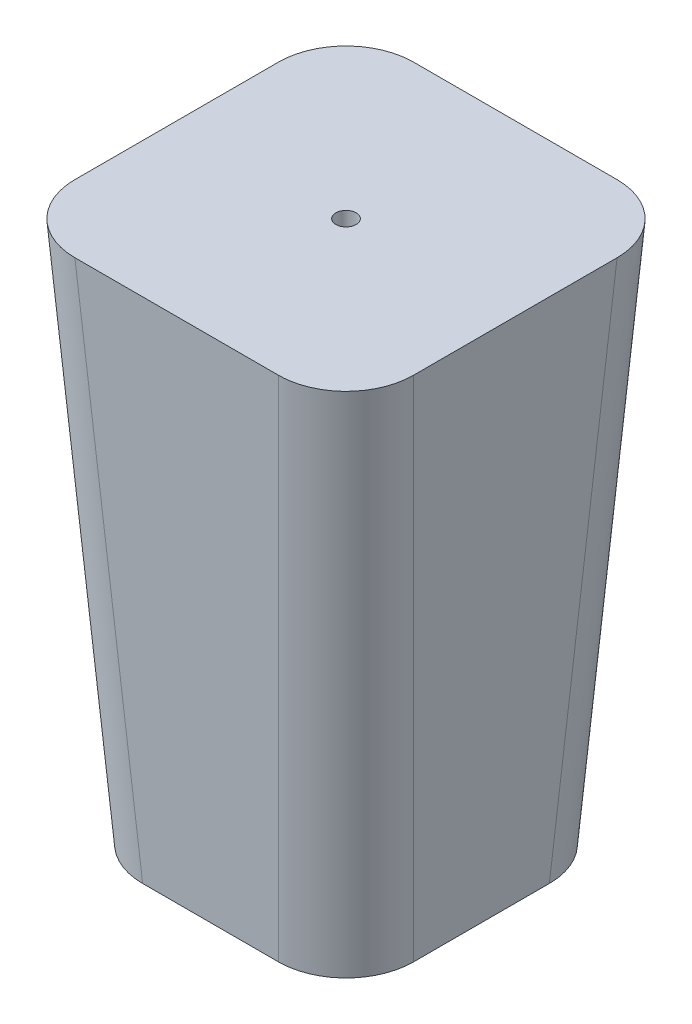
ISO-10303-21;
HEADER;
FILE_DESCRIPTION(('STEP AP214'),'2;1');
FILE_NAME('part.step','',(''),(''),'','','');
FILE_SCHEMA(('AUTOMOTIVE_DESIGN { 1 0 10303 214 1 1 1 1 }'));
ENDSEC;
DATA;
#1=APPLICATION_CONTEXT('core data for automotive mechanical design processes');
#2=APPLICATION_PROTOCOL_DEFINITION('international standard','automotive_design',2000,#1);
#3=PRODUCT_CONTEXT('',#1,'mechanical');
#4=PRODUCT('Part','Part','',(#3));
#5=PRODUCT_RELATED_PRODUCT_CATEGORY('part','',(#4));
#6=PRODUCT_DEFINITION_FORMATION('','',#4);
#7=PRODUCT_DEFINITION_CONTEXT('part definition',#1,'design');
#8=PRODUCT_DEFINITION('design','',#6,#7);
#9=PRODUCT_DEFINITION_SHAPE('','',#8);
#10=(LENGTH_UNIT() NAMED_UNIT(*) SI_UNIT(.MILLI.,.METRE.));
#11=(NAMED_UNIT(*) PLANE_ANGLE_UNIT() SI_UNIT($,.RADIAN.));
#12=(NAMED_UNIT(*) SI_UNIT($,.STERADIAN.) SOLID_ANGLE_UNIT());
#13=UNCERTAINTY_MEASURE_WITH_UNIT(LENGTH_MEASURE(1.E-05),#10,'distance_accuracy_value','');
#14=(GEOMETRIC_REPRESENTATION_CONTEXT(3) GLOBAL_UNCERTAINTY_ASSIGNED_CONTEXT((#13)) GLOBAL_UNIT_ASSIGNED_CONTEXT((#10,
#11,#12)) REPRESENTATION_CONTEXT('',''));
#15=CARTESIAN_POINT('',(0.,0.,0.));
#16=DIRECTION('',(0.,0.,1.));
#17=DIRECTION('',(1.,0.,0.));
#18=AXIS2_PLACEMENT_3D('',#15,#16,#17);
#19=CARTESIAN_POINT('',(0.,0.,0.));
#20=DIRECTION('',(0.,-1.,0.));
#21=DIRECTION('',(0.,0.,-1.));
#22=AXIS2_PLACEMENT_3D('',#19,#20,#21);
#23=PLANE('',#22);
#24=CARTESIAN_POINT('',(0.,0.,0.));
#25=DIRECTION('',(0.,1.,0.));
#26=DIRECTION('',(0.,0.,1.));
#27=AXIS2_PLACEMENT_3D('',#24,#25,#26);
#28=CIRCLE('',#27,1.5);
#29=CARTESIAN_POINT('',(0.,0.,1.5));
#30=VERTEX_POINT('',#29);
#31=EDGE_CURVE('E484',#30,#30,#28,.T.);
#32=ORIENTED_EDGE('',*,*,#31,.T.);
#33=EDGE_LOOP('',(#32));
#34=FACE_BOUND('',#33,.T.);
#35=DIRECTION('',(1.,0.,0.));
#36=VECTOR('',#35,1.);
#37=CARTESIAN_POINT('',(-20.,0.,20.));
#38=LINE('',#37,#36);
#39=CARTESIAN_POINT('',(-10.0194742151711,0.,20.));
#40=VERTEX_POINT('',#39);
#41=CARTESIAN_POINT('',(10.0194742151711,0.,20.));
#42=VERTEX_POINT('',#41);
#43=EDGE_CURVE('E131',#40,#42,#38,.T.);
#44=ORIENTED_EDGE('',*,*,#43,.F.);
#45=CARTESIAN_POINT('',(-9.98048778632413,0.,9.98048778632413));
#46=DIRECTION('',(0.,-1.,0.));
#47=DIRECTION('',(0.707106781186548,0.,-0.707106781186548));
#48=AXIS2_PLACEMENT_3D('',#45,#46,#47);
#49=ELLIPSE('',#48,10.0389865026306,10.);
#50=CARTESIAN_POINT('',(-20.,0.,10.0194742151711));
#51=VERTEX_POINT('',#50);
#52=EDGE_CURVE('E114',#40,#51,#49,.T.);
#53=ORIENTED_EDGE('',*,*,#52,.T.);
#54=DIRECTION('',(0.,0.,1.));
#55=VECTOR('',#54,1.);
#56=CARTESIAN_POINT('',(-20.,0.,20.));
#57=LINE('',#56,#55);
#58=CARTESIAN_POINT('',(-20.,0.,-10.0194742151711));
#59=VERTEX_POINT('',#58);
#60=EDGE_CURVE('E142',#59,#51,#57,.T.);
#61=ORIENTED_EDGE('',*,*,#60,.F.);
#62=CARTESIAN_POINT('',(-9.98048778632413,0.,-9.98048778632412));
#63=DIRECTION('',(0.,-1.,0.));
#64=DIRECTION('',(0.707106781186547,0.,0.707106781186548));
#65=AXIS2_PLACEMENT_3D('',#62,#63,#64);
#66=ELLIPSE('',#65,10.0389865026306,10.);
#67=CARTESIAN_POINT('',(-10.0194742151711,0.,-20.));
#68=VERTEX_POINT('',#67);
#69=EDGE_CURVE('E125',#59,#68,#66,.T.);
#70=ORIENTED_EDGE('',*,*,#69,.T.);
#71=DIRECTION('',(-1.,0.,0.));
#72=VECTOR('',#71,1.);
#73=CARTESIAN_POINT('',(-20.,0.,-20.));
#74=LINE('',#73,#72);
#75=CARTESIAN_POINT('',(10.0194742151711,0.,-20.));
#76=VERTEX_POINT('',#75);
#77=EDGE_CURVE('E198',#76,#68,#74,.T.);
#78=ORIENTED_EDGE('',*,*,#77,.F.);
#79=CARTESIAN_POINT('',(9.98048778632412,0.,-9.98048778632412));
#80=DIRECTION('',(0.,-1.,0.));
#81=DIRECTION('',(-0.707106781186548,0.,0.707106781186548));
#82=AXIS2_PLACEMENT_3D('',#79,#80,#81);
#83=ELLIPSE('',#82,10.0389865026306,10.);
#84=CARTESIAN_POINT('',(20.,0.,-10.0194742151711));
#85=VERTEX_POINT('',#84);
#86=EDGE_CURVE('E333',#76,#85,#83,.T.);
#87=ORIENTED_EDGE('',*,*,#86,.T.);
#88=DIRECTION('',(0.,0.,-1.));
#89=VECTOR('',#88,1.);
#90=CARTESIAN_POINT('',(20.,0.,20.));
#91=LINE('',#90,#89);
#92=CARTESIAN_POINT('',(20.,0.,10.0194742151711));
#93=VERTEX_POINT('',#92);
#94=EDGE_CURVE('E454',#93,#85,#91,.T.);
#95=ORIENTED_EDGE('',*,*,#94,.F.);
#96=CARTESIAN_POINT('',(9.98048778632412,0.,9.98048778632413));
#97=DIRECTION('',(0.,-1.,0.));
#98=DIRECTION('',(-0.707106781186548,0.,-0.707106781186547));
#99=AXIS2_PLACEMENT_3D('',#96,#97,#98);
#100=ELLIPSE('',#99,10.0389865026306,10.);
#101=EDGE_CURVE('E137',#93,#42,#100,.T.);
#102=ORIENTED_EDGE('',*,*,#101,.T.);
#103=EDGE_LOOP('',(#44,#53,#61,#70,#78,#87,#95,#102));
#104=FACE_BOUND('',#103,.T.);
#105=ADVANCED_FACE('F45',(#34,#104),#23,.T.);
#106=CARTESIAN_POINT('',(0.,80.,0.));
#107=DIRECTION('',(0.,-1.,0.));
#108=DIRECTION('',(0.,0.,-1.));
#109=AXIS2_PLACEMENT_3D('',#106,#107,#108);
#110=PLANE('',#109);
#111=CARTESIAN_POINT('',(0.,80.,0.));
#112=DIRECTION('',(0.,1.,0.));
#113=DIRECTION('',(0.,0.,1.));
#114=AXIS2_PLACEMENT_3D('',#111,#112,#113);
#115=CIRCLE('',#114,1.5);
#116=CARTESIAN_POINT('',(0.,80.,1.5));
#117=VERTEX_POINT('',#116);
#118=EDGE_CURVE('E478',#117,#117,#115,.T.);
#119=ORIENTED_EDGE('',*,*,#118,.F.);
#120=EDGE_LOOP('',(#119));
#121=FACE_BOUND('',#120,.T.);
#122=DIRECTION('',(0.,0.,1.));
#123=VECTOR('',#122,1.);
#124=CARTESIAN_POINT('',(-25.,80.,25.));
#125=LINE('',#124,#123);
#126=CARTESIAN_POINT('',(-25.,80.,-15.0194742151711));
#127=VERTEX_POINT('',#126);
#128=CARTESIAN_POINT('',(-25.,80.,15.0194742151711));
#129=VERTEX_POINT('',#128);
#130=EDGE_CURVE('E272',#127,#129,#125,.T.);
#131=ORIENTED_EDGE('',*,*,#130,.T.);
#132=CARTESIAN_POINT('',(-14.9804877863241,80.,14.9804877863241));
#133=DIRECTION('',(0.,-1.,0.));
#134=DIRECTION('',(0.707106781186548,0.,-0.707106781186548));
#135=AXIS2_PLACEMENT_3D('',#132,#133,#134);
#136=ELLIPSE('',#135,10.0389865026306,10.);
#137=CARTESIAN_POINT('',(-15.0194742151711,80.,25.));
#138=VERTEX_POINT('',#137);
#139=EDGE_CURVE('E252',#129,#138,#136,.F.);
#140=ORIENTED_EDGE('',*,*,#139,.T.);
#141=DIRECTION('',(1.,0.,0.));
#142=VECTOR('',#141,1.);
#143=CARTESIAN_POINT('',(-25.,80.,25.));
#144=LINE('',#143,#142);
#145=CARTESIAN_POINT('',(15.0194742151711,80.,25.));
#146=VERTEX_POINT('',#145);
#147=EDGE_CURVE('E135',#138,#146,#144,.T.);
#148=ORIENTED_EDGE('',*,*,#147,.T.);
#149=CARTESIAN_POINT('',(14.9804877863241,80.,14.9804877863241));
#150=DIRECTION('',(0.,-1.,0.));
#151=DIRECTION('',(-0.707106781186548,0.,-0.707106781186547));
#152=AXIS2_PLACEMENT_3D('',#149,#150,#151);
#153=ELLIPSE('',#152,10.0389865026306,10.);
#154=CARTESIAN_POINT('',(25.,80.,15.0194742151711));
#155=VERTEX_POINT('',#154);
#156=EDGE_CURVE('E243',#146,#155,#153,.F.);
#157=ORIENTED_EDGE('',*,*,#156,.T.);
#158=DIRECTION('',(0.,0.,-1.));
#159=VECTOR('',#158,1.);
#160=CARTESIAN_POINT('',(25.,80.,25.));
#161=LINE('',#160,#159);
#162=CARTESIAN_POINT('',(25.,80.,-15.0194742151711));
#163=VERTEX_POINT('',#162);
#164=EDGE_CURVE('E49',#155,#163,#161,.T.);
#165=ORIENTED_EDGE('',*,*,#164,.T.);
#166=CARTESIAN_POINT('',(14.9804877863241,80.,-14.9804877863241));
#167=DIRECTION('',(0.,-1.,0.));
#168=DIRECTION('',(-0.707106781186548,0.,0.707106781186548));
#169=AXIS2_PLACEMENT_3D('',#166,#167,#168);
#170=ELLIPSE('',#169,10.0389865026306,10.);
#171=CARTESIAN_POINT('',(15.0194742151711,80.,-25.));
#172=VERTEX_POINT('',#171);
#173=EDGE_CURVE('E70',#163,#172,#170,.F.);
#174=ORIENTED_EDGE('',*,*,#173,.T.);
#175=DIRECTION('',(-1.,0.,0.));
#176=VECTOR('',#175,1.);
#177=CARTESIAN_POINT('',(-25.,80.,-25.));
#178=LINE('',#177,#176);
#179=CARTESIAN_POINT('',(-15.0194742151711,80.,-25.));
#180=VERTEX_POINT('',#179);
#181=EDGE_CURVE('E239',#172,#180,#178,.T.);
#182=ORIENTED_EDGE('',*,*,#181,.T.);
#183=CARTESIAN_POINT('',(-14.9804877863241,80.,-14.9804877863241));
#184=DIRECTION('',(0.,-1.,0.));
#185=DIRECTION('',(0.707106781186547,0.,0.707106781186548));
#186=AXIS2_PLACEMENT_3D('',#183,#184,#185);
#187=ELLIPSE('',#186,10.0389865026306,10.);
#188=EDGE_CURVE('E248',#180,#127,#187,.F.);
#189=ORIENTED_EDGE('',*,*,#188,.T.);
#190=EDGE_LOOP('',(#131,#140,#148,#157,#165,#174,#182,#189));
#191=FACE_BOUND('',#190,.T.);
#192=ADVANCED_FACE('F166',(#121,#191),#110,.F.);
#193=CARTESIAN_POINT('',(-15.0909843525142,80.,25.));
#194=DIRECTION('',(0.,-0.0623782861551805,0.998052578482889));
#195=DIRECTION('',(-1.,0.,0.));
#196=AXIS2_PLACEMENT_3D('',#193,#194,#195);
#197=PLANE('',#196);
#198=ORIENTED_EDGE('',*,*,#147,.F.);
#199=DIRECTION('',(0.062257280636469,-0.996116490183505,-0.062257280636469));
#200=VECTOR('',#199,1.);
#201=CARTESIAN_POINT('',(-15.0197513862461,80.0044347371996,25.000277171075));
#202=LINE('',#201,#200);
#203=EDGE_CURVE('E118',#138,#40,#202,.T.);
#204=ORIENTED_EDGE('',*,*,#203,.T.);
#205=ORIENTED_EDGE('',*,*,#43,.T.);
#206=DIRECTION('',(-0.0622572806364691,-0.996116490183505,-0.062257280636469));
#207=VECTOR('',#206,1.);
#208=CARTESIAN_POINT('',(14.9027670114204,78.1326847399885,24.8832927962493));
#209=LINE('',#208,#207);
#210=EDGE_CURVE('E138',#42,#146,#209,.F.);
#211=ORIENTED_EDGE('',*,*,#210,.T.);
#212=EDGE_LOOP('',(#198,#204,#205,#211));
#213=FACE_BOUND('',#212,.T.);
#214=ADVANCED_FACE('F130',(#213),#197,.T.);
#215=CARTESIAN_POINT('',(-25.,80.,25.));
#216=DIRECTION('',(-0.998052578482889,-0.0623782861551805,0.));
#217=DIRECTION('',(0.,0.,-1.));
#218=AXIS2_PLACEMENT_3D('',#215,#216,#217);
#219=PLANE('',#218);
#220=ORIENTED_EDGE('',*,*,#60,.T.);
#221=DIRECTION('',(0.062257280636469,-0.996116490183505,-0.062257280636469));
#222=VECTOR('',#221,1.);
#223=CARTESIAN_POINT('',(-25.0386842084683,80.6189473354933,15.0581584236394));
#224=LINE('',#223,#222);
#225=EDGE_CURVE('E119',#51,#129,#224,.F.);
#226=ORIENTED_EDGE('',*,*,#225,.T.);
#227=ORIENTED_EDGE('',*,*,#130,.F.);
#228=DIRECTION('',(0.062257280636469,-0.996116490183505,0.0622572806364691));
#229=VECTOR('',#228,1.);
#230=CARTESIAN_POINT('',(-24.8448857588559,77.5181721416948,-14.864359974027));
#231=LINE('',#230,#229);
#232=EDGE_CURVE('E124',#127,#59,#231,.T.);
#233=ORIENTED_EDGE('',*,*,#232,.T.);
#234=EDGE_LOOP('',(#220,#226,#227,#233));
#235=FACE_BOUND('',#234,.T.);
#236=ADVANCED_FACE('F218',(#235),#219,.T.);
#237=CARTESIAN_POINT('',(-25.,80.,-25.));
#238=DIRECTION('',(0.,-0.0623782861551806,-0.998052578482889));
#239=DIRECTION('',(1.,0.,0.));
#240=AXIS2_PLACEMENT_3D('',#237,#238,#239);
#241=PLANE('',#240);
#242=ORIENTED_EDGE('',*,*,#77,.T.);
#243=DIRECTION('',(0.062257280636469,-0.996116490183505,0.0622572806364691));
#244=VECTOR('',#243,1.);
#245=CARTESIAN_POINT('',(-15.0581584236394,80.6189473354933,-25.0386842084683));
#246=LINE('',#245,#244);
#247=EDGE_CURVE('E63',#68,#180,#246,.F.);
#248=ORIENTED_EDGE('',*,*,#247,.T.);
#249=ORIENTED_EDGE('',*,*,#181,.F.);
#250=DIRECTION('',(-0.0622572806364691,-0.996116490183505,0.0622572806364691));
#251=VECTOR('',#250,1.);
#252=CARTESIAN_POINT('',(14.864359974027,77.5181721416948,-24.8448857588559));
#253=LINE('',#252,#251);
#254=EDGE_CURVE('E256',#172,#76,#253,.T.);
#255=ORIENTED_EDGE('',*,*,#254,.T.);
#256=EDGE_LOOP('',(#242,#248,#249,#255));
#257=FACE_BOUND('',#256,.T.);
#258=ADVANCED_FACE('F210',(#257),#241,.T.);
#259=CARTESIAN_POINT('',(25.,80.,-25.));
#260=DIRECTION('',(0.998052578482889,-0.0623782861551806,0.));
#261=DIRECTION('',(0.,0.,1.));
#262=AXIS2_PLACEMENT_3D('',#259,#260,#261);
#263=PLANE('',#262);
#264=ORIENTED_EDGE('',*,*,#94,.T.);
#265=DIRECTION('',(-0.0622572806364691,-0.996116490183505,0.0622572806364691));
#266=VECTOR('',#265,1.);
#267=CARTESIAN_POINT('',(25.0386842084683,80.6189473354933,-15.0581584236394));
#268=LINE('',#267,#266);
#269=EDGE_CURVE('E12',#85,#163,#268,.F.);
#270=ORIENTED_EDGE('',*,*,#269,.T.);
#271=ORIENTED_EDGE('',*,*,#164,.F.);
#272=DIRECTION('',(-0.0622572806364691,-0.996116490183505,-0.062257280636469));
#273=VECTOR('',#272,1.);
#274=CARTESIAN_POINT('',(24.8448857588559,77.5181721416948,14.864359974027));
#275=LINE('',#274,#273);
#276=EDGE_CURVE('E55',#155,#93,#275,.T.);
#277=ORIENTED_EDGE('',*,*,#276,.T.);
#278=EDGE_LOOP('',(#264,#270,#271,#277));
#279=FACE_BOUND('',#278,.T.);
#280=ADVANCED_FACE('F168',(#279),#263,.T.);
#281=CARTESIAN_POINT('',(0.,77.,0.));
#282=DIRECTION('',(0.,1.,0.));
#283=DIRECTION('',(0.,0.,1.));
#284=AXIS2_PLACEMENT_3D('',#281,#282,#283);
#285=CYLINDRICAL_SURFACE('',#284,1.5);
#286=CARTESIAN_POINT('',(0.,77.,0.));
#287=DIRECTION('',(0.,1.,0.));
#288=DIRECTION('',(0.,0.,1.));
#289=AXIS2_PLACEMENT_3D('',#286,#287,#288);
#290=CIRCLE('',#289,1.5);
#291=CARTESIAN_POINT('',(0.,77.,1.5));
#292=VERTEX_POINT('',#291);
#293=EDGE_CURVE('E330',#292,#292,#290,.T.);
#294=ORIENTED_EDGE('',*,*,#293,.F.);
#295=EDGE_LOOP('',(#294));
#296=FACE_BOUND('',#295,.T.);
#297=ORIENTED_EDGE('',*,*,#118,.T.);
#298=EDGE_LOOP('',(#297));
#299=FACE_BOUND('',#298,.T.);
#300=ADVANCED_FACE('F293',(#296,#299),#285,.F.);
#301=CARTESIAN_POINT('',(0.,77.,0.));
#302=DIRECTION('',(0.,1.,0.));
#303=DIRECTION('',(0.,0.,1.));
#304=AXIS2_PLACEMENT_3D('',#301,#302,#303);
#305=PLANE('',#304);
#306=ORIENTED_EDGE('',*,*,#293,.T.);
#307=EDGE_LOOP('',(#306));
#308=FACE_BOUND('',#307,.T.);
#309=ADVANCED_FACE('F381',(#308),#305,.T.);
#310=CARTESIAN_POINT('',(0.,3.,0.));
#311=DIRECTION('',(0.,-1.,0.));
#312=DIRECTION('',(0.,0.,-1.));
#313=AXIS2_PLACEMENT_3D('',#310,#311,#312);
#314=CYLINDRICAL_SURFACE('',#313,1.5);
#315=CARTESIAN_POINT('',(0.,3.,0.));
#316=DIRECTION('',(0.,1.,0.));
#317=DIRECTION('',(0.,0.,1.));
#318=AXIS2_PLACEMENT_3D('',#315,#316,#317);
#319=CIRCLE('',#318,1.5);
#320=CARTESIAN_POINT('',(0.,3.,1.5));
#321=VERTEX_POINT('',#320);
#322=EDGE_CURVE('E481',#321,#321,#319,.T.);
#323=ORIENTED_EDGE('',*,*,#322,.T.);
#324=EDGE_LOOP('',(#323));
#325=FACE_BOUND('',#324,.T.);
#326=ORIENTED_EDGE('',*,*,#31,.F.);
#327=EDGE_LOOP('',(#326));
#328=FACE_BOUND('',#327,.T.);
#329=ADVANCED_FACE('F369',(#325,#328),#314,.F.);
#330=CARTESIAN_POINT('',(0.,3.,0.));
#331=DIRECTION('',(0.,-1.,0.));
#332=DIRECTION('',(0.,0.,1.));
#333=AXIS2_PLACEMENT_3D('',#330,#331,#332);
#334=PLANE('',#333);
#335=ORIENTED_EDGE('',*,*,#322,.F.);
#336=EDGE_LOOP('',(#335));
#337=FACE_BOUND('',#336,.T.);
#338=ADVANCED_FACE('F364',(#337),#334,.T.);
#339=CARTESIAN_POINT('',(-15.0197513862461,80.6282175987514,15.0197513862461));
#340=DIRECTION('',(0.062257280636469,-0.996116490183505,-0.062257280636469));
#341=DIRECTION('',(0.,0.0623782861551805,-0.998052578482889));
#342=AXIS2_PLACEMENT_3D('',#339,#340,#341);
#343=CYLINDRICAL_SURFACE('',#342,10.);
#344=ORIENTED_EDGE('',*,*,#139,.F.);
#345=ORIENTED_EDGE('',*,*,#225,.F.);
#346=ORIENTED_EDGE('',*,*,#52,.F.);
#347=ORIENTED_EDGE('',*,*,#203,.F.);
#348=EDGE_LOOP('',(#344,#345,#346,#347));
#349=FACE_BOUND('',#348,.T.);
#350=ADVANCED_FACE('F117',(#349),#343,.T.);
#351=CARTESIAN_POINT('',(-14.864359974027,78.1419550032466,-14.864359974027));
#352=DIRECTION('',(0.062257280636469,-0.996116490183505,0.0622572806364691));
#353=DIRECTION('',(0.,-0.0623782861551806,-0.998052578482889));
#354=AXIS2_PLACEMENT_3D('',#351,#352,#353);
#355=CYLINDRICAL_SURFACE('',#354,10.);
#356=ORIENTED_EDGE('',*,*,#188,.F.);
#357=ORIENTED_EDGE('',*,*,#247,.F.);
#358=ORIENTED_EDGE('',*,*,#69,.F.);
#359=ORIENTED_EDGE('',*,*,#232,.F.);
#360=EDGE_LOOP('',(#356,#357,#358,#359));
#361=FACE_BOUND('',#360,.T.);
#362=ADVANCED_FACE('F344',(#361),#355,.T.);
#363=CARTESIAN_POINT('',(14.864359974027,78.1419550032466,-14.864359974027));
#364=DIRECTION('',(-0.0622572806364691,-0.996116490183505,0.0622572806364691));
#365=DIRECTION('',(0.,-0.0623782861551806,-0.998052578482889));
#366=AXIS2_PLACEMENT_3D('',#363,#364,#365);
#367=CYLINDRICAL_SURFACE('',#366,10.);
#368=ORIENTED_EDGE('',*,*,#173,.F.);
#369=ORIENTED_EDGE('',*,*,#269,.F.);
#370=ORIENTED_EDGE('',*,*,#86,.F.);
#371=ORIENTED_EDGE('',*,*,#254,.F.);
#372=EDGE_LOOP('',(#368,#369,#370,#371));
#373=FACE_BOUND('',#372,.T.);
#374=ADVANCED_FACE('F436',(#373),#367,.T.);
#375=CARTESIAN_POINT('',(14.864359974027,78.1419550032466,14.864359974027));
#376=DIRECTION('',(-0.0622572806364691,-0.996116490183505,-0.062257280636469));
#377=DIRECTION('',(0.998052578482889,-0.0623782861551806,0.));
#378=AXIS2_PLACEMENT_3D('',#375,#376,#377);
#379=CYLINDRICAL_SURFACE('',#378,10.);
#380=ORIENTED_EDGE('',*,*,#156,.F.);
#381=ORIENTED_EDGE('',*,*,#210,.F.);
#382=ORIENTED_EDGE('',*,*,#101,.F.);
#383=ORIENTED_EDGE('',*,*,#276,.F.);
#384=EDGE_LOOP('',(#380,#381,#382,#383));
#385=FACE_BOUND('',#384,.T.);
#386=ADVANCED_FACE('F47',(#385),#379,.T.);
#387=CLOSED_SHELL('',(#105,#192,#214,#236,#258,#280,#300,#309,#329,#338,#350,#362,#374,#386));
#388=MANIFOLD_SOLID_BREP('B2',#387);
#389=ADVANCED_BREP_SHAPE_REPRESENTATION('',(#18,#388),#14);
#390=SHAPE_DEFINITION_REPRESENTATION(#9,#389);
ENDSEC;
END-ISO-10303-21;
